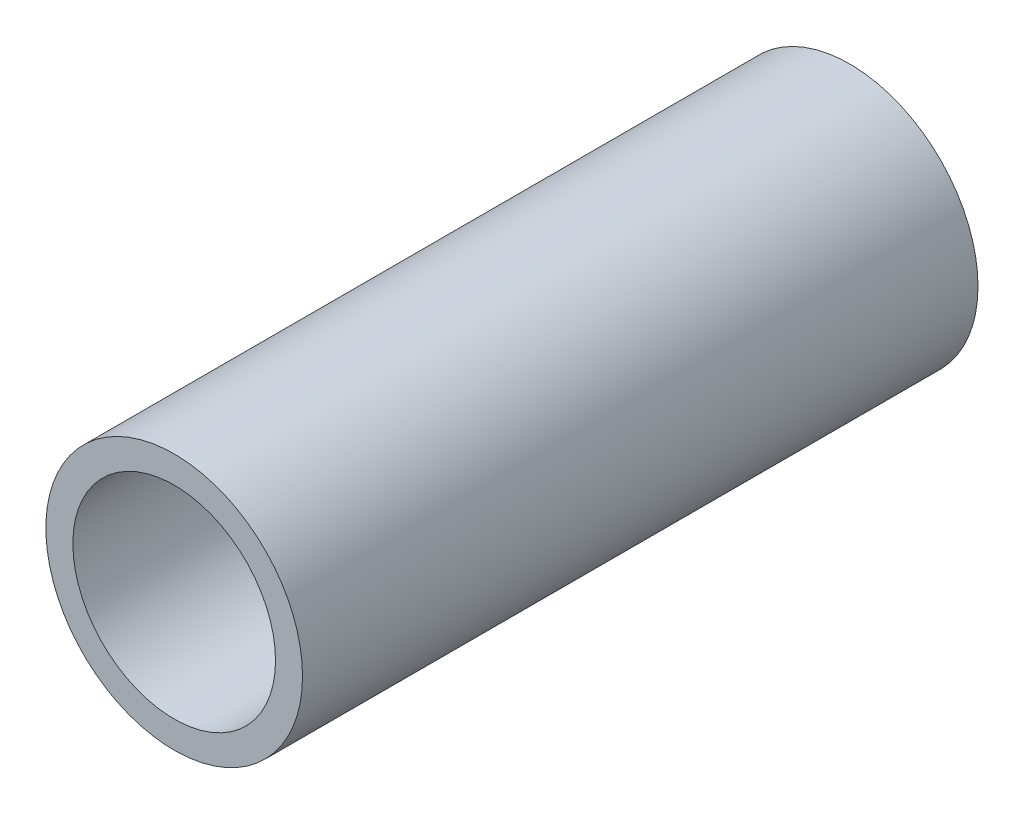
ISO-10303-21;
HEADER;
FILE_DESCRIPTION(('STEP AP214'),'2;1');
FILE_NAME('part.step','',(''),(''),'','','');
FILE_SCHEMA(('AUTOMOTIVE_DESIGN { 1 0 10303 214 1 1 1 1 }'));
ENDSEC;
DATA;
#1=APPLICATION_CONTEXT('core data for automotive mechanical design processes');
#2=APPLICATION_PROTOCOL_DEFINITION('international standard','automotive_design',2000,#1);
#3=PRODUCT_CONTEXT('',#1,'mechanical');
#4=PRODUCT('Part','Part','',(#3));
#5=PRODUCT_RELATED_PRODUCT_CATEGORY('part','',(#4));
#6=PRODUCT_DEFINITION_FORMATION('','',#4);
#7=PRODUCT_DEFINITION_CONTEXT('part definition',#1,'design');
#8=PRODUCT_DEFINITION('design','',#6,#7);
#9=PRODUCT_DEFINITION_SHAPE('','',#8);
#10=(LENGTH_UNIT() NAMED_UNIT(*) SI_UNIT(.MILLI.,.METRE.));
#11=(NAMED_UNIT(*) PLANE_ANGLE_UNIT() SI_UNIT($,.RADIAN.));
#12=(NAMED_UNIT(*) SI_UNIT($,.STERADIAN.) SOLID_ANGLE_UNIT());
#13=UNCERTAINTY_MEASURE_WITH_UNIT(LENGTH_MEASURE(1.E-05),#10,'distance_accuracy_value','');
#14=(GEOMETRIC_REPRESENTATION_CONTEXT(3) GLOBAL_UNCERTAINTY_ASSIGNED_CONTEXT((#13)) GLOBAL_UNIT_ASSIGNED_CONTEXT((#10,
#11,#12)) REPRESENTATION_CONTEXT('',''));
#15=CARTESIAN_POINT('',(0.,0.,0.));
#16=DIRECTION('',(0.,0.,1.));
#17=DIRECTION('',(1.,0.,0.));
#18=AXIS2_PLACEMENT_3D('',#15,#16,#17);
#19=CARTESIAN_POINT('',(50.,0.,50.));
#20=DIRECTION('',(0.,0.,1.));
#21=DIRECTION('',(1.,0.,0.));
#22=AXIS2_PLACEMENT_3D('',#19,#20,#21);
#23=PLANE('',#22);
#24=CARTESIAN_POINT('',(50.,0.,50.));
#25=DIRECTION('',(0.,0.,1.));
#26=DIRECTION('',(1.,0.,0.));
#27=AXIS2_PLACEMENT_3D('',#24,#25,#26);
#28=CIRCLE('',#27,9.5);
#29=CARTESIAN_POINT('',(59.5,0.,50.));
#30=VERTEX_POINT('',#29);
#31=EDGE_CURVE('E11',#30,#30,#28,.T.);
#32=ORIENTED_EDGE('',*,*,#31,.T.);
#33=EDGE_LOOP('',(#32));
#34=FACE_BOUND('',#33,.T.);
#35=CARTESIAN_POINT('',(50.,0.,50.));
#36=DIRECTION('',(0.,0.,1.));
#37=DIRECTION('',(1.,0.,0.));
#38=AXIS2_PLACEMENT_3D('',#35,#36,#37);
#39=CIRCLE('',#38,7.5);
#40=CARTESIAN_POINT('',(57.5,0.,50.));
#41=VERTEX_POINT('',#40);
#42=EDGE_CURVE('E48',#41,#41,#39,.T.);
#43=ORIENTED_EDGE('',*,*,#42,.F.);
#44=EDGE_LOOP('',(#43));
#45=FACE_BOUND('',#44,.T.);
#46=ADVANCED_FACE('F37',(#34,#45),#23,.T.);
#47=CARTESIAN_POINT('',(50.,0.,0.));
#48=DIRECTION('',(0.,0.,1.));
#49=DIRECTION('',(1.,0.,0.));
#50=AXIS2_PLACEMENT_3D('',#47,#48,#49);
#51=PLANE('',#50);
#52=CARTESIAN_POINT('',(50.,0.,0.));
#53=DIRECTION('',(0.,0.,1.));
#54=DIRECTION('',(1.,0.,0.));
#55=AXIS2_PLACEMENT_3D('',#52,#53,#54);
#56=CIRCLE('',#55,9.5);
#57=CARTESIAN_POINT('',(59.5,0.,0.));
#58=VERTEX_POINT('',#57);
#59=EDGE_CURVE('E41',#58,#58,#56,.T.);
#60=ORIENTED_EDGE('',*,*,#59,.F.);
#61=EDGE_LOOP('',(#60));
#62=FACE_BOUND('',#61,.T.);
#63=CARTESIAN_POINT('',(50.,0.,0.));
#64=DIRECTION('',(0.,0.,1.));
#65=DIRECTION('',(1.,0.,0.));
#66=AXIS2_PLACEMENT_3D('',#63,#64,#65);
#67=CIRCLE('',#66,7.5);
#68=CARTESIAN_POINT('',(57.5,0.,0.));
#69=VERTEX_POINT('',#68);
#70=EDGE_CURVE('E50',#69,#69,#67,.T.);
#71=ORIENTED_EDGE('',*,*,#70,.T.);
#72=EDGE_LOOP('',(#71));
#73=FACE_BOUND('',#72,.T.);
#74=ADVANCED_FACE('F60',(#62,#73),#51,.F.);
#75=CARTESIAN_POINT('',(50.,0.,50.));
#76=DIRECTION('',(0.,0.,-1.));
#77=DIRECTION('',(-1.,0.,0.));
#78=AXIS2_PLACEMENT_3D('',#75,#76,#77);
#79=CYLINDRICAL_SURFACE('',#78,9.5);
#80=ORIENTED_EDGE('',*,*,#31,.F.);
#81=EDGE_LOOP('',(#80));
#82=FACE_BOUND('',#81,.T.);
#83=ORIENTED_EDGE('',*,*,#59,.T.);
#84=EDGE_LOOP('',(#83));
#85=FACE_BOUND('',#84,.T.);
#86=ADVANCED_FACE('F39',(#82,#85),#79,.T.);
#87=CARTESIAN_POINT('',(50.,0.,50.));
#88=DIRECTION('',(0.,0.,-1.));
#89=DIRECTION('',(-1.,0.,0.));
#90=AXIS2_PLACEMENT_3D('',#87,#88,#89);
#91=CYLINDRICAL_SURFACE('',#90,7.5);
#92=ORIENTED_EDGE('',*,*,#42,.T.);
#93=EDGE_LOOP('',(#92));
#94=FACE_BOUND('',#93,.T.);
#95=ORIENTED_EDGE('',*,*,#70,.F.);
#96=EDGE_LOOP('',(#95));
#97=FACE_BOUND('',#96,.T.);
#98=ADVANCED_FACE('F56',(#94,#97),#91,.F.);
#99=CLOSED_SHELL('',(#46,#74,#86,#98));
#100=MANIFOLD_SOLID_BREP('B2',#99);
#101=ADVANCED_BREP_SHAPE_REPRESENTATION('',(#18,#100),#14);
#102=SHAPE_DEFINITION_REPRESENTATION(#9,#101);
ENDSEC;
END-ISO-10303-21;
